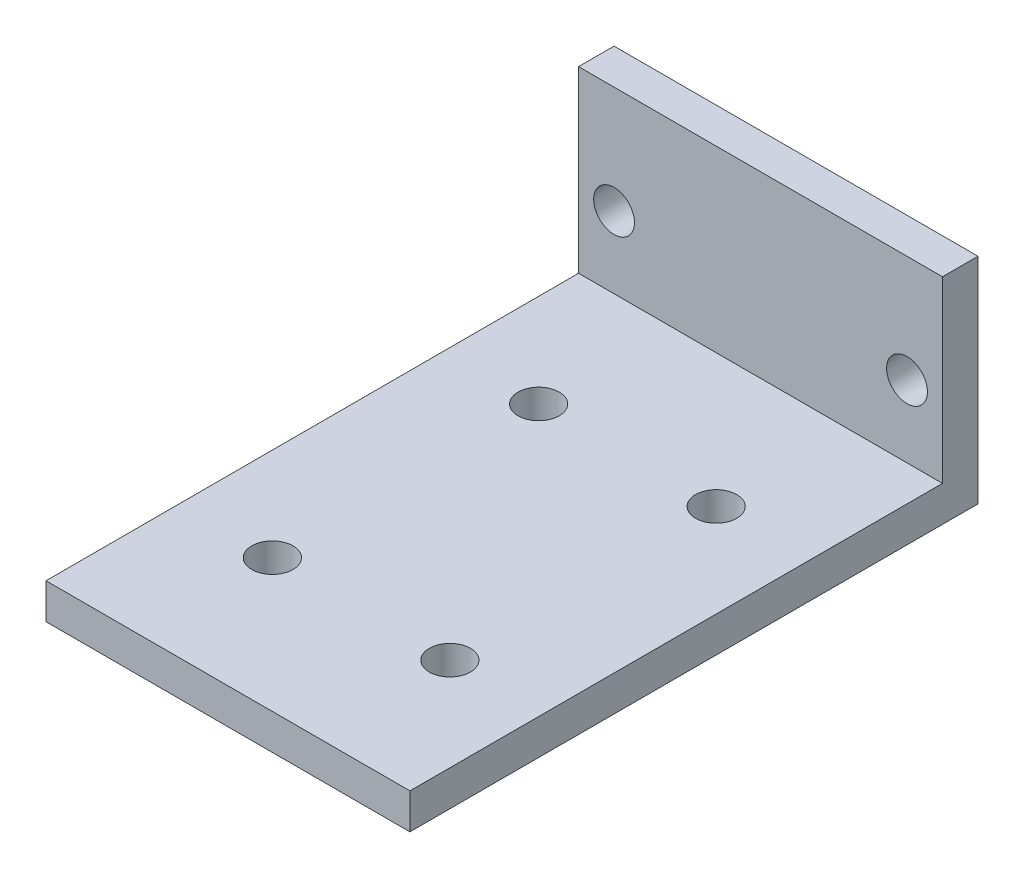
ISO-10303-21;
HEADER;
FILE_DESCRIPTION(('STEP AP214'),'2;1');
FILE_NAME('part.step','',(''),(''),'','','');
FILE_SCHEMA(('AUTOMOTIVE_DESIGN { 1 0 10303 214 1 1 1 1 }'));
ENDSEC;
DATA;
#1=APPLICATION_CONTEXT('core data for automotive mechanical design processes');
#2=APPLICATION_PROTOCOL_DEFINITION('international standard','automotive_design',2000,#1);
#3=PRODUCT_CONTEXT('',#1,'mechanical');
#4=PRODUCT('Part','Part','',(#3));
#5=PRODUCT_RELATED_PRODUCT_CATEGORY('part','',(#4));
#6=PRODUCT_DEFINITION_FORMATION('','',#4);
#7=PRODUCT_DEFINITION_CONTEXT('part definition',#1,'design');
#8=PRODUCT_DEFINITION('design','',#6,#7);
#9=PRODUCT_DEFINITION_SHAPE('','',#8);
#10=(LENGTH_UNIT() NAMED_UNIT(*) SI_UNIT(.MILLI.,.METRE.));
#11=(NAMED_UNIT(*) PLANE_ANGLE_UNIT() SI_UNIT($,.RADIAN.));
#12=(NAMED_UNIT(*) SI_UNIT($,.STERADIAN.) SOLID_ANGLE_UNIT());
#13=UNCERTAINTY_MEASURE_WITH_UNIT(LENGTH_MEASURE(1.E-05),#10,'distance_accuracy_value','');
#14=(GEOMETRIC_REPRESENTATION_CONTEXT(3) GLOBAL_UNCERTAINTY_ASSIGNED_CONTEXT((#13)) GLOBAL_UNIT_ASSIGNED_CONTEXT((#10,
#11,#12)) REPRESENTATION_CONTEXT('',''));
#15=CARTESIAN_POINT('',(0.,0.,0.));
#16=DIRECTION('',(0.,0.,1.));
#17=DIRECTION('',(1.,0.,0.));
#18=AXIS2_PLACEMENT_3D('',#15,#16,#17);
#19=CARTESIAN_POINT('',(0.,0.,2.54));
#20=DIRECTION('',(0.,0.,1.));
#21=DIRECTION('',(1.,0.,0.));
#22=AXIS2_PLACEMENT_3D('',#19,#20,#21);
#23=PLANE('',#22);
#24=DIRECTION('',(-1.,0.,0.));
#25=VECTOR('',#24,1.);
#26=CARTESIAN_POINT('',(-13.0175,-5.1308,2.54));
#27=LINE('',#26,#25);
#28=CARTESIAN_POINT('',(13.0175,-5.1308,2.54));
#29=VERTEX_POINT('',#28);
#30=CARTESIAN_POINT('',(-13.0175,-5.1308,2.54));
#31=VERTEX_POINT('',#30);
#32=EDGE_CURVE('E55',#29,#31,#27,.T.);
#33=ORIENTED_EDGE('',*,*,#32,.F.);
#34=DIRECTION('',(0.,1.,0.));
#35=VECTOR('',#34,1.);
#36=CARTESIAN_POINT('',(13.0175,7.6708,2.54));
#37=LINE('',#36,#35);
#38=CARTESIAN_POINT('',(13.0175,7.6708,2.54));
#39=VERTEX_POINT('',#38);
#40=EDGE_CURVE('E176',#29,#39,#37,.T.);
#41=ORIENTED_EDGE('',*,*,#40,.T.);
#42=DIRECTION('',(-1.,0.,0.));
#43=VECTOR('',#42,1.);
#44=CARTESIAN_POINT('',(-13.0175,7.6708,2.54));
#45=LINE('',#44,#43);
#46=CARTESIAN_POINT('',(-13.0175,7.6708,2.54));
#47=VERTEX_POINT('',#46);
#48=EDGE_CURVE('E61',#39,#47,#45,.T.);
#49=ORIENTED_EDGE('',*,*,#48,.T.);
#50=DIRECTION('',(0.,-1.,0.));
#51=VECTOR('',#50,1.);
#52=CARTESIAN_POINT('',(-13.0175,7.6708,2.54));
#53=LINE('',#52,#51);
#54=EDGE_CURVE('E91',#47,#31,#53,.T.);
#55=ORIENTED_EDGE('',*,*,#54,.T.);
#56=EDGE_LOOP('',(#33,#41,#49,#55));
#57=FACE_BOUND('',#56,.T.);
#58=CARTESIAN_POINT('',(-10.4775,0.,2.54));
#59=DIRECTION('',(0.,0.,1.));
#60=DIRECTION('',(1.,0.,0.));
#61=AXIS2_PLACEMENT_3D('',#58,#59,#60);
#62=CIRCLE('',#61,1.4605);
#63=CARTESIAN_POINT('',(-9.017,0.,2.54));
#64=VERTEX_POINT('',#63);
#65=EDGE_CURVE('E105',#64,#64,#62,.T.);
#66=ORIENTED_EDGE('',*,*,#65,.F.);
#67=EDGE_LOOP('',(#66));
#68=FACE_BOUND('',#67,.T.);
#69=CARTESIAN_POINT('',(10.4775,0.,2.54));
#70=DIRECTION('',(0.,0.,1.));
#71=DIRECTION('',(1.,0.,0.));
#72=AXIS2_PLACEMENT_3D('',#69,#70,#71);
#73=CIRCLE('',#72,1.4605);
#74=CARTESIAN_POINT('',(11.938,0.,2.54));
#75=VERTEX_POINT('',#74);
#76=EDGE_CURVE('E165',#75,#75,#73,.T.);
#77=ORIENTED_EDGE('',*,*,#76,.F.);
#78=EDGE_LOOP('',(#77));
#79=FACE_BOUND('',#78,.T.);
#80=ADVANCED_FACE('F39',(#57,#68,#79),#23,.T.);
#81=CARTESIAN_POINT('',(0.,0.,0.));
#82=DIRECTION('',(0.,0.,1.));
#83=DIRECTION('',(1.,0.,0.));
#84=AXIS2_PLACEMENT_3D('',#81,#82,#83);
#85=PLANE('',#84);
#86=DIRECTION('',(0.,-1.,0.));
#87=VECTOR('',#86,1.);
#88=CARTESIAN_POINT('',(-13.0175,7.6708,0.));
#89=LINE('',#88,#87);
#90=CARTESIAN_POINT('',(-13.0175,7.6708,0.));
#91=VERTEX_POINT('',#90);
#92=CARTESIAN_POINT('',(-13.0175,-7.6708,0.));
#93=VERTEX_POINT('',#92);
#94=EDGE_CURVE('E97',#91,#93,#89,.T.);
#95=ORIENTED_EDGE('',*,*,#94,.F.);
#96=DIRECTION('',(-1.,0.,0.));
#97=VECTOR('',#96,1.);
#98=CARTESIAN_POINT('',(-13.0175,7.6708,0.));
#99=LINE('',#98,#97);
#100=CARTESIAN_POINT('',(13.0175,7.6708,0.));
#101=VERTEX_POINT('',#100);
#102=EDGE_CURVE('E80',#101,#91,#99,.T.);
#103=ORIENTED_EDGE('',*,*,#102,.F.);
#104=DIRECTION('',(0.,1.,0.));
#105=VECTOR('',#104,1.);
#106=CARTESIAN_POINT('',(13.0175,7.6708,0.));
#107=LINE('',#106,#105);
#108=CARTESIAN_POINT('',(13.0175,-7.6708,0.));
#109=VERTEX_POINT('',#108);
#110=EDGE_CURVE('E92',#109,#101,#107,.T.);
#111=ORIENTED_EDGE('',*,*,#110,.F.);
#112=DIRECTION('',(1.,0.,0.));
#113=VECTOR('',#112,1.);
#114=CARTESIAN_POINT('',(-13.0175,-7.6708,0.));
#115=LINE('',#114,#113);
#116=EDGE_CURVE('E103',#93,#109,#115,.T.);
#117=ORIENTED_EDGE('',*,*,#116,.F.);
#118=EDGE_LOOP('',(#95,#103,#111,#117));
#119=FACE_BOUND('',#118,.T.);
#120=CARTESIAN_POINT('',(-10.4775,0.,0.));
#121=DIRECTION('',(0.,0.,1.));
#122=DIRECTION('',(1.,0.,0.));
#123=AXIS2_PLACEMENT_3D('',#120,#121,#122);
#124=CIRCLE('',#123,1.4605);
#125=CARTESIAN_POINT('',(-9.017,0.,0.));
#126=VERTEX_POINT('',#125);
#127=EDGE_CURVE('E111',#126,#126,#124,.T.);
#128=ORIENTED_EDGE('',*,*,#127,.T.);
#129=EDGE_LOOP('',(#128));
#130=FACE_BOUND('',#129,.T.);
#131=CARTESIAN_POINT('',(10.4775,0.,0.));
#132=DIRECTION('',(0.,0.,1.));
#133=DIRECTION('',(1.,0.,0.));
#134=AXIS2_PLACEMENT_3D('',#131,#132,#133);
#135=CIRCLE('',#134,1.4605);
#136=CARTESIAN_POINT('',(11.938,0.,0.));
#137=VERTEX_POINT('',#136);
#138=EDGE_CURVE('E164',#137,#137,#135,.T.);
#139=ORIENTED_EDGE('',*,*,#138,.T.);
#140=EDGE_LOOP('',(#139));
#141=FACE_BOUND('',#140,.T.);
#142=ADVANCED_FACE('F101',(#119,#130,#141),#85,.F.);
#143=CARTESIAN_POINT('',(-13.0175,7.6708,2.54));
#144=DIRECTION('',(1.,0.,0.));
#145=DIRECTION('',(0.,0.,-1.));
#146=AXIS2_PLACEMENT_3D('',#143,#144,#145);
#147=PLANE('',#146);
#148=ORIENTED_EDGE('',*,*,#94,.T.);
#149=DIRECTION('',(0.,0.,-1.));
#150=VECTOR('',#149,1.);
#151=CARTESIAN_POINT('',(-13.0175,-7.6708,2.54));
#152=LINE('',#151,#150);
#153=CARTESIAN_POINT('',(-13.0175,-7.6708,40.64));
#154=VERTEX_POINT('',#153);
#155=EDGE_CURVE('E11',#154,#93,#152,.T.);
#156=ORIENTED_EDGE('',*,*,#155,.F.);
#157=DIRECTION('',(0.,-1.,0.));
#158=VECTOR('',#157,1.);
#159=CARTESIAN_POINT('',(-13.0175,-7.6708,40.64));
#160=LINE('',#159,#158);
#161=CARTESIAN_POINT('',(-13.0175,-5.1308,40.64));
#162=VERTEX_POINT('',#161);
#163=EDGE_CURVE('E142',#162,#154,#160,.T.);
#164=ORIENTED_EDGE('',*,*,#163,.F.);
#165=DIRECTION('',(0.,0.,-1.));
#166=VECTOR('',#165,1.);
#167=CARTESIAN_POINT('',(-13.0175,-5.1308,40.64));
#168=LINE('',#167,#166);
#169=EDGE_CURVE('E154',#162,#31,#168,.T.);
#170=ORIENTED_EDGE('',*,*,#169,.T.);
#171=ORIENTED_EDGE('',*,*,#54,.F.);
#172=DIRECTION('',(0.,0.,-1.));
#173=VECTOR('',#172,1.);
#174=CARTESIAN_POINT('',(-13.0175,7.6708,2.54));
#175=LINE('',#174,#173);
#176=EDGE_CURVE('E83',#47,#91,#175,.T.);
#177=ORIENTED_EDGE('',*,*,#176,.T.);
#178=EDGE_LOOP('',(#148,#156,#164,#170,#171,#177));
#179=FACE_BOUND('',#178,.T.);
#180=ADVANCED_FACE('F41',(#179),#147,.F.);
#181=CARTESIAN_POINT('',(-13.0175,-7.6708,2.54));
#182=DIRECTION('',(0.,1.,0.));
#183=DIRECTION('',(0.,0.,1.));
#184=AXIS2_PLACEMENT_3D('',#181,#182,#183);
#185=PLANE('',#184);
#186=CARTESIAN_POINT('',(-6.35,-7.6708,12.065));
#187=DIRECTION('',(0.,1.,0.));
#188=DIRECTION('',(0.,0.,1.));
#189=AXIS2_PLACEMENT_3D('',#186,#187,#188);
#190=CIRCLE('',#189,1.4732);
#191=CARTESIAN_POINT('',(-6.35,-7.6708,13.5382));
#192=VERTEX_POINT('',#191);
#193=EDGE_CURVE('E222',#192,#192,#190,.T.);
#194=ORIENTED_EDGE('',*,*,#193,.T.);
#195=EDGE_LOOP('',(#194));
#196=FACE_BOUND('',#195,.T.);
#197=CARTESIAN_POINT('',(6.35,-7.6708,12.065));
#198=DIRECTION('',(0.,1.,0.));
#199=DIRECTION('',(0.,0.,1.));
#200=AXIS2_PLACEMENT_3D('',#197,#198,#199);
#201=CIRCLE('',#200,1.4732);
#202=CARTESIAN_POINT('',(6.35,-7.6708,13.5382));
#203=VERTEX_POINT('',#202);
#204=EDGE_CURVE('E226',#203,#203,#201,.T.);
#205=ORIENTED_EDGE('',*,*,#204,.T.);
#206=EDGE_LOOP('',(#205));
#207=FACE_BOUND('',#206,.T.);
#208=CARTESIAN_POINT('',(-6.35,-7.6708,31.115));
#209=DIRECTION('',(0.,1.,0.));
#210=DIRECTION('',(0.,0.,1.));
#211=AXIS2_PLACEMENT_3D('',#208,#209,#210);
#212=CIRCLE('',#211,1.4732);
#213=CARTESIAN_POINT('',(-6.35,-7.6708,32.5882));
#214=VERTEX_POINT('',#213);
#215=EDGE_CURVE('E230',#214,#214,#212,.T.);
#216=ORIENTED_EDGE('',*,*,#215,.T.);
#217=EDGE_LOOP('',(#216));
#218=FACE_BOUND('',#217,.T.);
#219=CARTESIAN_POINT('',(6.35,-7.6708,31.115));
#220=DIRECTION('',(0.,1.,0.));
#221=DIRECTION('',(0.,0.,1.));
#222=AXIS2_PLACEMENT_3D('',#219,#220,#221);
#223=CIRCLE('',#222,1.4732);
#224=CARTESIAN_POINT('',(6.35,-7.6708,32.5882));
#225=VERTEX_POINT('',#224);
#226=EDGE_CURVE('E157',#225,#225,#223,.T.);
#227=ORIENTED_EDGE('',*,*,#226,.T.);
#228=EDGE_LOOP('',(#227));
#229=FACE_BOUND('',#228,.T.);
#230=ORIENTED_EDGE('',*,*,#116,.T.);
#231=DIRECTION('',(0.,0.,-1.));
#232=VECTOR('',#231,1.);
#233=CARTESIAN_POINT('',(13.0175,-7.6708,2.54));
#234=LINE('',#233,#232);
#235=CARTESIAN_POINT('',(13.0175,-7.6708,40.64));
#236=VERTEX_POINT('',#235);
#237=EDGE_CURVE('E48',#236,#109,#234,.T.);
#238=ORIENTED_EDGE('',*,*,#237,.F.);
#239=DIRECTION('',(1.,0.,0.));
#240=VECTOR('',#239,1.);
#241=CARTESIAN_POINT('',(-13.0175,-7.6708,40.64));
#242=LINE('',#241,#240);
#243=EDGE_CURVE('E134',#154,#236,#242,.T.);
#244=ORIENTED_EDGE('',*,*,#243,.F.);
#245=ORIENTED_EDGE('',*,*,#155,.T.);
#246=EDGE_LOOP('',(#230,#238,#244,#245));
#247=FACE_BOUND('',#246,.T.);
#248=ADVANCED_FACE('F132',(#196,#207,#218,#229,#247),#185,.F.);
#249=CARTESIAN_POINT('',(13.0175,7.6708,2.54));
#250=DIRECTION('',(-1.,0.,0.));
#251=DIRECTION('',(0.,0.,1.));
#252=AXIS2_PLACEMENT_3D('',#249,#250,#251);
#253=PLANE('',#252);
#254=ORIENTED_EDGE('',*,*,#110,.T.);
#255=DIRECTION('',(0.,0.,-1.));
#256=VECTOR('',#255,1.);
#257=CARTESIAN_POINT('',(13.0175,7.6708,2.54));
#258=LINE('',#257,#256);
#259=EDGE_CURVE('E86',#39,#101,#258,.T.);
#260=ORIENTED_EDGE('',*,*,#259,.F.);
#261=ORIENTED_EDGE('',*,*,#40,.F.);
#262=DIRECTION('',(0.,0.,-1.));
#263=VECTOR('',#262,1.);
#264=CARTESIAN_POINT('',(13.0175,-5.1308,40.64));
#265=LINE('',#264,#263);
#266=CARTESIAN_POINT('',(13.0175,-5.1308,40.64));
#267=VERTEX_POINT('',#266);
#268=EDGE_CURVE('E160',#267,#29,#265,.T.);
#269=ORIENTED_EDGE('',*,*,#268,.F.);
#270=DIRECTION('',(0.,1.,0.));
#271=VECTOR('',#270,1.);
#272=CARTESIAN_POINT('',(13.0175,-7.6708,40.64));
#273=LINE('',#272,#271);
#274=EDGE_CURVE('E128',#236,#267,#273,.T.);
#275=ORIENTED_EDGE('',*,*,#274,.F.);
#276=ORIENTED_EDGE('',*,*,#237,.T.);
#277=EDGE_LOOP('',(#254,#260,#261,#269,#275,#276));
#278=FACE_BOUND('',#277,.T.);
#279=ADVANCED_FACE('F124',(#278),#253,.F.);
#280=CARTESIAN_POINT('',(-13.0175,7.6708,2.54));
#281=DIRECTION('',(0.,-1.,0.));
#282=DIRECTION('',(0.,0.,-1.));
#283=AXIS2_PLACEMENT_3D('',#280,#281,#282);
#284=PLANE('',#283);
#285=ORIENTED_EDGE('',*,*,#102,.T.);
#286=ORIENTED_EDGE('',*,*,#176,.F.);
#287=ORIENTED_EDGE('',*,*,#48,.F.);
#288=ORIENTED_EDGE('',*,*,#259,.T.);
#289=EDGE_LOOP('',(#285,#286,#287,#288));
#290=FACE_BOUND('',#289,.T.);
#291=ADVANCED_FACE('F82',(#290),#284,.F.);
#292=CARTESIAN_POINT('',(-10.4775,0.,2.54));
#293=DIRECTION('',(0.,0.,-1.));
#294=DIRECTION('',(-1.,0.,0.));
#295=AXIS2_PLACEMENT_3D('',#292,#293,#294);
#296=CYLINDRICAL_SURFACE('',#295,1.4605);
#297=ORIENTED_EDGE('',*,*,#65,.T.);
#298=EDGE_LOOP('',(#297));
#299=FACE_BOUND('',#298,.T.);
#300=ORIENTED_EDGE('',*,*,#127,.F.);
#301=EDGE_LOOP('',(#300));
#302=FACE_BOUND('',#301,.T.);
#303=ADVANCED_FACE('F198',(#299,#302),#296,.F.);
#304=CARTESIAN_POINT('',(10.4775,0.,2.54));
#305=DIRECTION('',(0.,0.,-1.));
#306=DIRECTION('',(-1.,0.,0.));
#307=AXIS2_PLACEMENT_3D('',#304,#305,#306);
#308=CYLINDRICAL_SURFACE('',#307,1.4605);
#309=ORIENTED_EDGE('',*,*,#76,.T.);
#310=EDGE_LOOP('',(#309));
#311=FACE_BOUND('',#310,.T.);
#312=ORIENTED_EDGE('',*,*,#138,.F.);
#313=EDGE_LOOP('',(#312));
#314=FACE_BOUND('',#313,.T.);
#315=ADVANCED_FACE('F189',(#311,#314),#308,.F.);
#316=CARTESIAN_POINT('',(-13.0175,-5.1308,40.64));
#317=DIRECTION('',(0.,-1.,0.));
#318=DIRECTION('',(0.,0.,-1.));
#319=AXIS2_PLACEMENT_3D('',#316,#317,#318);
#320=PLANE('',#319);
#321=CARTESIAN_POINT('',(-6.35,-5.1308,12.065));
#322=DIRECTION('',(0.,1.,0.));
#323=DIRECTION('',(0.,0.,1.));
#324=AXIS2_PLACEMENT_3D('',#321,#322,#323);
#325=CIRCLE('',#324,1.4732);
#326=CARTESIAN_POINT('',(-6.35,-5.1308,13.5382));
#327=VERTEX_POINT('',#326);
#328=EDGE_CURVE('E254',#327,#327,#325,.T.);
#329=ORIENTED_EDGE('',*,*,#328,.F.);
#330=EDGE_LOOP('',(#329));
#331=FACE_BOUND('',#330,.T.);
#332=CARTESIAN_POINT('',(6.35,-5.1308,12.065));
#333=DIRECTION('',(0.,1.,0.));
#334=DIRECTION('',(0.,0.,1.));
#335=AXIS2_PLACEMENT_3D('',#332,#333,#334);
#336=CIRCLE('',#335,1.4732);
#337=CARTESIAN_POINT('',(6.35,-5.1308,13.5382));
#338=VERTEX_POINT('',#337);
#339=EDGE_CURVE('E248',#338,#338,#336,.T.);
#340=ORIENTED_EDGE('',*,*,#339,.F.);
#341=EDGE_LOOP('',(#340));
#342=FACE_BOUND('',#341,.T.);
#343=CARTESIAN_POINT('',(-6.35,-5.1308,31.115));
#344=DIRECTION('',(0.,1.,0.));
#345=DIRECTION('',(0.,0.,1.));
#346=AXIS2_PLACEMENT_3D('',#343,#344,#345);
#347=CIRCLE('',#346,1.4732);
#348=CARTESIAN_POINT('',(-6.35,-5.1308,32.5882));
#349=VERTEX_POINT('',#348);
#350=EDGE_CURVE('E242',#349,#349,#347,.T.);
#351=ORIENTED_EDGE('',*,*,#350,.F.);
#352=EDGE_LOOP('',(#351));
#353=FACE_BOUND('',#352,.T.);
#354=CARTESIAN_POINT('',(6.35,-5.1308,31.115));
#355=DIRECTION('',(0.,1.,0.));
#356=DIRECTION('',(0.,0.,1.));
#357=AXIS2_PLACEMENT_3D('',#354,#355,#356);
#358=CIRCLE('',#357,1.4732);
#359=CARTESIAN_POINT('',(6.35,-5.1308,32.5882));
#360=VERTEX_POINT('',#359);
#361=EDGE_CURVE('E235',#360,#360,#358,.T.);
#362=ORIENTED_EDGE('',*,*,#361,.F.);
#363=EDGE_LOOP('',(#362));
#364=FACE_BOUND('',#363,.T.);
#365=ORIENTED_EDGE('',*,*,#32,.T.);
#366=ORIENTED_EDGE('',*,*,#169,.F.);
#367=DIRECTION('',(-1.,0.,0.));
#368=VECTOR('',#367,1.);
#369=CARTESIAN_POINT('',(-13.0175,-5.1308,40.64));
#370=LINE('',#369,#368);
#371=EDGE_CURVE('E147',#267,#162,#370,.T.);
#372=ORIENTED_EDGE('',*,*,#371,.F.);
#373=ORIENTED_EDGE('',*,*,#268,.T.);
#374=EDGE_LOOP('',(#365,#366,#372,#373));
#375=FACE_BOUND('',#374,.T.);
#376=ADVANCED_FACE('F182',(#331,#342,#353,#364,#375),#320,.F.);
#377=CARTESIAN_POINT('',(0.,0.,40.64));
#378=DIRECTION('',(0.,0.,-1.));
#379=DIRECTION('',(-1.,0.,0.));
#380=AXIS2_PLACEMENT_3D('',#377,#378,#379);
#381=PLANE('',#380);
#382=ORIENTED_EDGE('',*,*,#163,.T.);
#383=ORIENTED_EDGE('',*,*,#243,.T.);
#384=ORIENTED_EDGE('',*,*,#274,.T.);
#385=ORIENTED_EDGE('',*,*,#371,.T.);
#386=EDGE_LOOP('',(#382,#383,#384,#385));
#387=FACE_BOUND('',#386,.T.);
#388=ADVANCED_FACE('F139',(#387),#381,.F.);
#389=CARTESIAN_POINT('',(6.35,-5.1308,31.115));
#390=DIRECTION('',(0.,1.,0.));
#391=DIRECTION('',(0.,0.,1.));
#392=AXIS2_PLACEMENT_3D('',#389,#390,#391);
#393=CYLINDRICAL_SURFACE('',#392,1.4732);
#394=ORIENTED_EDGE('',*,*,#361,.T.);
#395=EDGE_LOOP('',(#394));
#396=FACE_BOUND('',#395,.T.);
#397=ORIENTED_EDGE('',*,*,#226,.F.);
#398=EDGE_LOOP('',(#397));
#399=FACE_BOUND('',#398,.T.);
#400=ADVANCED_FACE('F196',(#396,#399),#393,.F.);
#401=CARTESIAN_POINT('',(-6.35,-5.1308,31.115));
#402=DIRECTION('',(0.,1.,0.));
#403=DIRECTION('',(0.,0.,1.));
#404=AXIS2_PLACEMENT_3D('',#401,#402,#403);
#405=CYLINDRICAL_SURFACE('',#404,1.4732);
#406=ORIENTED_EDGE('',*,*,#350,.T.);
#407=EDGE_LOOP('',(#406));
#408=FACE_BOUND('',#407,.T.);
#409=ORIENTED_EDGE('',*,*,#215,.F.);
#410=EDGE_LOOP('',(#409));
#411=FACE_BOUND('',#410,.T.);
#412=ADVANCED_FACE('F266',(#408,#411),#405,.F.);
#413=CARTESIAN_POINT('',(6.35,-5.1308,12.065));
#414=DIRECTION('',(0.,1.,0.));
#415=DIRECTION('',(0.,0.,1.));
#416=AXIS2_PLACEMENT_3D('',#413,#414,#415);
#417=CYLINDRICAL_SURFACE('',#416,1.4732);
#418=ORIENTED_EDGE('',*,*,#339,.T.);
#419=EDGE_LOOP('',(#418));
#420=FACE_BOUND('',#419,.T.);
#421=ORIENTED_EDGE('',*,*,#204,.F.);
#422=EDGE_LOOP('',(#421));
#423=FACE_BOUND('',#422,.T.);
#424=ADVANCED_FACE('F261',(#420,#423),#417,.F.);
#425=CARTESIAN_POINT('',(-6.35,-5.1308,12.065));
#426=DIRECTION('',(0.,1.,0.));
#427=DIRECTION('',(0.,0.,1.));
#428=AXIS2_PLACEMENT_3D('',#425,#426,#427);
#429=CYLINDRICAL_SURFACE('',#428,1.4732);
#430=ORIENTED_EDGE('',*,*,#328,.T.);
#431=EDGE_LOOP('',(#430));
#432=FACE_BOUND('',#431,.T.);
#433=ORIENTED_EDGE('',*,*,#193,.F.);
#434=EDGE_LOOP('',(#433));
#435=FACE_BOUND('',#434,.T.);
#436=ADVANCED_FACE('F258',(#432,#435),#429,.F.);
#437=CLOSED_SHELL('',(#80,#142,#180,#248,#279,#291,#303,#315,#376,#388,#400,#412,#424,#436));
#438=MANIFOLD_SOLID_BREP('B2',#437);
#439=ADVANCED_BREP_SHAPE_REPRESENTATION('',(#18,#438),#14);
#440=SHAPE_DEFINITION_REPRESENTATION(#9,#439);
ENDSEC;
END-ISO-10303-21;
